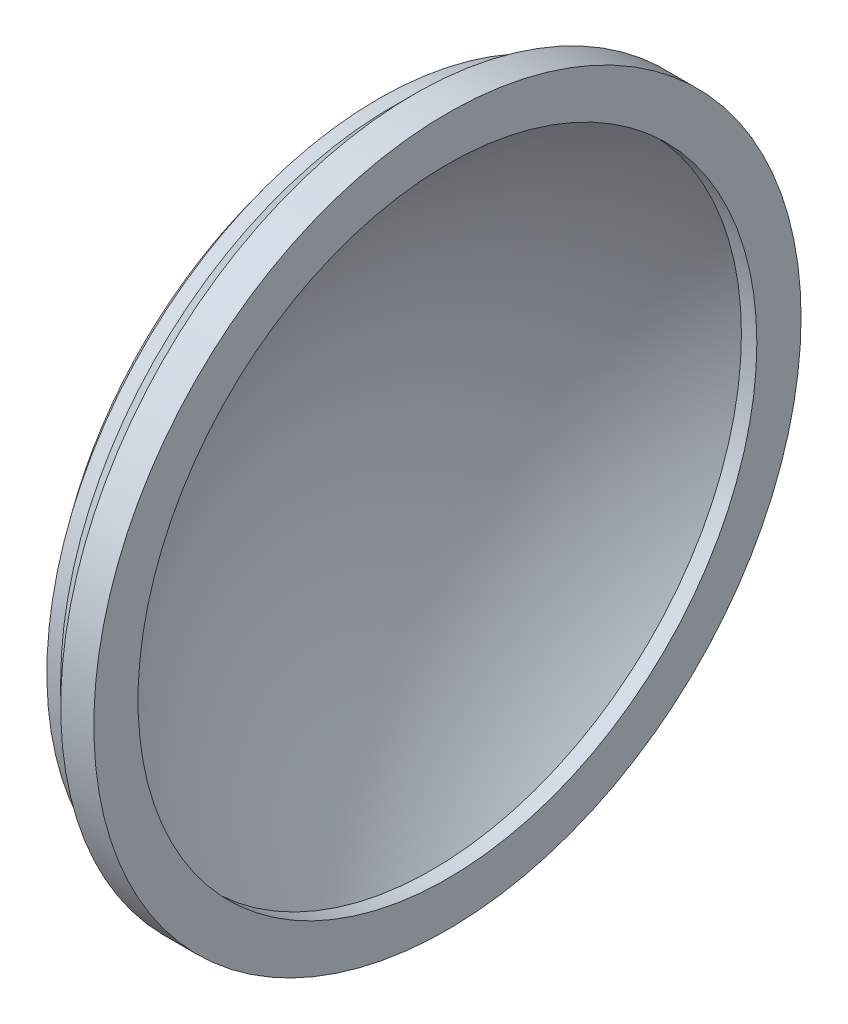
ISO-10303-21;
HEADER;
FILE_DESCRIPTION(('STEP AP214'),'2;1');
FILE_NAME('part.step','',(''),(''),'','','');
FILE_SCHEMA(('AUTOMOTIVE_DESIGN { 1 0 10303 214 1 1 1 1 }'));
ENDSEC;
DATA;
#1=APPLICATION_CONTEXT('core data for automotive mechanical design processes');
#2=APPLICATION_PROTOCOL_DEFINITION('international standard','automotive_design',2000,#1);
#3=PRODUCT_CONTEXT('',#1,'mechanical');
#4=PRODUCT('Part','Part','',(#3));
#5=PRODUCT_RELATED_PRODUCT_CATEGORY('part','',(#4));
#6=PRODUCT_DEFINITION_FORMATION('','',#4);
#7=PRODUCT_DEFINITION_CONTEXT('part definition',#1,'design');
#8=PRODUCT_DEFINITION('design','',#6,#7);
#9=PRODUCT_DEFINITION_SHAPE('','',#8);
#10=(LENGTH_UNIT() NAMED_UNIT(*) SI_UNIT(.MILLI.,.METRE.));
#11=(NAMED_UNIT(*) PLANE_ANGLE_UNIT() SI_UNIT($,.RADIAN.));
#12=(NAMED_UNIT(*) SI_UNIT($,.STERADIAN.) SOLID_ANGLE_UNIT());
#13=UNCERTAINTY_MEASURE_WITH_UNIT(LENGTH_MEASURE(1.E-05),#10,'distance_accuracy_value','');
#14=(GEOMETRIC_REPRESENTATION_CONTEXT(3) GLOBAL_UNCERTAINTY_ASSIGNED_CONTEXT((#13)) GLOBAL_UNIT_ASSIGNED_CONTEXT((#10,
#11,#12)) REPRESENTATION_CONTEXT('',''));
#15=CARTESIAN_POINT('',(0.,0.,0.));
#16=DIRECTION('',(0.,0.,1.));
#17=DIRECTION('',(1.,0.,0.));
#18=AXIS2_PLACEMENT_3D('',#15,#16,#17);
#19=CARTESIAN_POINT('',(114.528018660617,0.,0.));
#20=DIRECTION('',(1.,0.,0.));
#21=DIRECTION('',(0.,0.,-1.));
#22=AXIS2_PLACEMENT_3D('',#19,#20,#21);
#23=CYLINDRICAL_SURFACE('',#22,60.);
#24=CARTESIAN_POINT('',(-28.5,0.,0.));
#25=DIRECTION('',(1.,0.,0.));
#26=DIRECTION('',(0.,0.,-1.));
#27=AXIS2_PLACEMENT_3D('',#24,#25,#26);
#28=CIRCLE('',#27,60.);
#29=CARTESIAN_POINT('',(-28.5,0.,-60.));
#30=VERTEX_POINT('',#29);
#31=EDGE_CURVE('E10',#30,#30,#28,.T.);
#32=ORIENTED_EDGE('',*,*,#31,.T.);
#33=EDGE_LOOP('',(#32));
#34=FACE_BOUND('',#33,.T.);
#35=CARTESIAN_POINT('',(-26.,0.,0.));
#36=DIRECTION('',(1.,0.,0.));
#37=DIRECTION('',(0.,0.,-1.));
#38=AXIS2_PLACEMENT_3D('',#35,#36,#37);
#39=CIRCLE('',#38,60.);
#40=CARTESIAN_POINT('',(-26.,0.,-60.));
#41=VERTEX_POINT('',#40);
#42=EDGE_CURVE('E57',#41,#41,#39,.T.);
#43=ORIENTED_EDGE('',*,*,#42,.F.);
#44=EDGE_LOOP('',(#43));
#45=FACE_BOUND('',#44,.T.);
#46=ADVANCED_FACE('F35',(#34,#45),#23,.T.);
#47=CARTESIAN_POINT('',(45.1545993132811,0.,0.));
#48=DIRECTION('',(1.,0.,0.));
#49=DIRECTION('',(0.,1.,0.));
#50=AXIS2_PLACEMENT_3D('',#47,#48,#49);
#51=SPHERICAL_SURFACE('',#50,95.);
#52=ORIENTED_EDGE('',*,*,#31,.F.);
#53=EDGE_LOOP('',(#52));
#54=FACE_BOUND('',#53,.T.);
#55=ADVANCED_FACE('F65',(#54),#51,.T.);
#56=CARTESIAN_POINT('',(45.1545993132811,0.,0.));
#57=DIRECTION('',(1.,0.,0.));
#58=DIRECTION('',(0.,1.,0.));
#59=AXIS2_PLACEMENT_3D('',#56,#57,#58);
#60=SPHERICAL_SURFACE('',#59,85.);
#61=CARTESIAN_POINT('',(-18.7906898017115,0.,0.));
#62=DIRECTION('',(1.,0.,0.));
#63=DIRECTION('',(0.,0.,-1.));
#64=AXIS2_PLACEMENT_3D('',#61,#62,#63);
#65=CIRCLE('',#64,56.);
#66=CARTESIAN_POINT('',(-18.7906898017115,0.,-56.));
#67=VERTEX_POINT('',#66);
#68=EDGE_CURVE('E41',#67,#67,#65,.T.);
#69=ORIENTED_EDGE('',*,*,#68,.T.);
#70=EDGE_LOOP('',(#69));
#71=FACE_BOUND('',#70,.T.);
#72=ADVANCED_FACE('F69',(#71),#60,.F.);
#73=CARTESIAN_POINT('',(114.528018660617,0.,0.));
#74=DIRECTION('',(1.,0.,0.));
#75=DIRECTION('',(0.,0.,-1.));
#76=AXIS2_PLACEMENT_3D('',#73,#74,#75);
#77=CYLINDRICAL_SURFACE('',#76,56.);
#78=CARTESIAN_POINT('',(-16.,0.,0.));
#79=DIRECTION('',(1.,0.,0.));
#80=DIRECTION('',(0.,0.,-1.));
#81=AXIS2_PLACEMENT_3D('',#78,#79,#80);
#82=CIRCLE('',#81,56.);
#83=CARTESIAN_POINT('',(-16.,0.,-56.));
#84=VERTEX_POINT('',#83);
#85=EDGE_CURVE('E45',#84,#84,#82,.T.);
#86=ORIENTED_EDGE('',*,*,#85,.T.);
#87=EDGE_LOOP('',(#86));
#88=FACE_BOUND('',#87,.T.);
#89=ORIENTED_EDGE('',*,*,#68,.F.);
#90=EDGE_LOOP('',(#89));
#91=FACE_BOUND('',#90,.T.);
#92=ADVANCED_FACE('F74',(#88,#91),#77,.F.);
#93=CARTESIAN_POINT('',(-16.,56.,0.));
#94=DIRECTION('',(1.,0.,0.));
#95=DIRECTION('',(0.,0.,-1.));
#96=AXIS2_PLACEMENT_3D('',#93,#94,#95);
#97=PLANE('',#96);
#98=CARTESIAN_POINT('',(-16.,0.,0.));
#99=DIRECTION('',(1.,0.,0.));
#100=DIRECTION('',(0.,0.,-1.));
#101=AXIS2_PLACEMENT_3D('',#98,#99,#100);
#102=CIRCLE('',#101,64.);
#103=CARTESIAN_POINT('',(-16.,0.,-64.));
#104=VERTEX_POINT('',#103);
#105=EDGE_CURVE('E49',#104,#104,#102,.T.);
#106=ORIENTED_EDGE('',*,*,#105,.T.);
#107=EDGE_LOOP('',(#106));
#108=FACE_BOUND('',#107,.T.);
#109=ORIENTED_EDGE('',*,*,#85,.F.);
#110=EDGE_LOOP('',(#109));
#111=FACE_BOUND('',#110,.T.);
#112=ADVANCED_FACE('F79',(#108,#111),#97,.T.);
#113=CARTESIAN_POINT('',(114.528018660617,0.,0.));
#114=DIRECTION('',(1.,0.,0.));
#115=DIRECTION('',(0.,0.,-1.));
#116=AXIS2_PLACEMENT_3D('',#113,#114,#115);
#117=CYLINDRICAL_SURFACE('',#116,64.);
#118=CARTESIAN_POINT('',(-22.,0.,0.));
#119=DIRECTION('',(1.,0.,0.));
#120=DIRECTION('',(0.,0.,-1.));
#121=AXIS2_PLACEMENT_3D('',#118,#119,#120);
#122=CIRCLE('',#121,64.);
#123=CARTESIAN_POINT('',(-22.,0.,-64.));
#124=VERTEX_POINT('',#123);
#125=EDGE_CURVE('E54',#124,#124,#122,.T.);
#126=ORIENTED_EDGE('',*,*,#125,.T.);
#127=EDGE_LOOP('',(#126));
#128=FACE_BOUND('',#127,.T.);
#129=ORIENTED_EDGE('',*,*,#105,.F.);
#130=EDGE_LOOP('',(#129));
#131=FACE_BOUND('',#130,.T.);
#132=ADVANCED_FACE('F83',(#128,#131),#117,.T.);
#133=CARTESIAN_POINT('',(-22.,0.,0.));
#134=DIRECTION('',(1.,0.,0.));
#135=DIRECTION('',(0.,0.,-1.));
#136=AXIS2_PLACEMENT_3D('',#133,#134,#135);
#137=CONICAL_SURFACE('',#136,64.,0.785398163397444);
#138=ORIENTED_EDGE('',*,*,#42,.T.);
#139=EDGE_LOOP('',(#138));
#140=FACE_BOUND('',#139,.T.);
#141=ORIENTED_EDGE('',*,*,#125,.F.);
#142=EDGE_LOOP('',(#141));
#143=FACE_BOUND('',#142,.T.);
#144=ADVANCED_FACE('F61',(#140,#143),#137,.T.);
#145=CLOSED_SHELL('',(#46,#55,#72,#92,#112,#132,#144));
#146=MANIFOLD_SOLID_BREP('B2',#145);
#147=ADVANCED_BREP_SHAPE_REPRESENTATION('',(#18,#146),#14);
#148=SHAPE_DEFINITION_REPRESENTATION(#9,#147);
ENDSEC;
END-ISO-10303-21;
